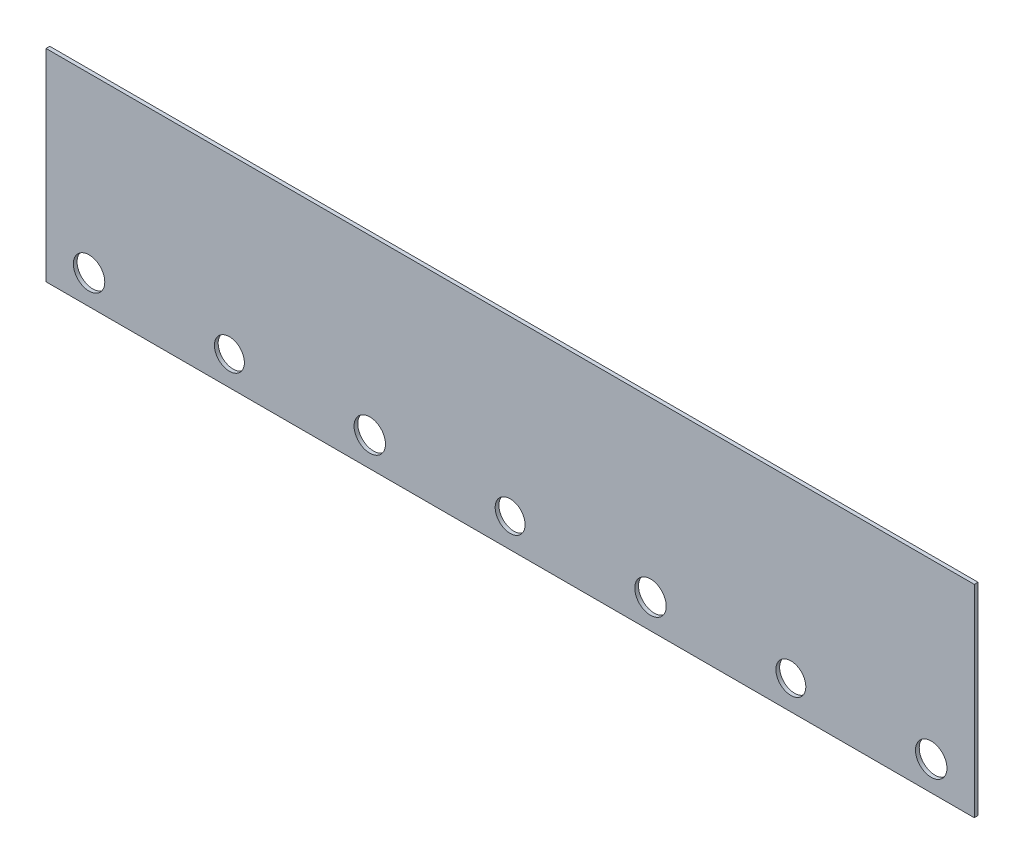
ISO-10303-21;
HEADER;
FILE_DESCRIPTION(('STEP AP214'),'2;1');
FILE_NAME('part.step','',(''),(''),'','','');
FILE_SCHEMA(('AUTOMOTIVE_DESIGN { 1 0 10303 214 1 1 1 1 }'));
ENDSEC;
DATA;
#1=APPLICATION_CONTEXT('core data for automotive mechanical design processes');
#2=APPLICATION_PROTOCOL_DEFINITION('international standard','automotive_design',2000,#1);
#3=PRODUCT_CONTEXT('',#1,'mechanical');
#4=PRODUCT('Part','Part','',(#3));
#5=PRODUCT_RELATED_PRODUCT_CATEGORY('part','',(#4));
#6=PRODUCT_DEFINITION_FORMATION('','',#4);
#7=PRODUCT_DEFINITION_CONTEXT('part definition',#1,'design');
#8=PRODUCT_DEFINITION('design','',#6,#7);
#9=PRODUCT_DEFINITION_SHAPE('','',#8);
#10=(LENGTH_UNIT() NAMED_UNIT(*) SI_UNIT(.MILLI.,.METRE.));
#11=(NAMED_UNIT(*) PLANE_ANGLE_UNIT() SI_UNIT($,.RADIAN.));
#12=(NAMED_UNIT(*) SI_UNIT($,.STERADIAN.) SOLID_ANGLE_UNIT());
#13=UNCERTAINTY_MEASURE_WITH_UNIT(LENGTH_MEASURE(1.E-05),#10,'distance_accuracy_value','');
#14=(GEOMETRIC_REPRESENTATION_CONTEXT(3) GLOBAL_UNCERTAINTY_ASSIGNED_CONTEXT((#13)) GLOBAL_UNIT_ASSIGNED_CONTEXT((#10,
#11,#12)) REPRESENTATION_CONTEXT('',''));
#15=CARTESIAN_POINT('',(0.,0.,0.));
#16=DIRECTION('',(0.,0.,1.));
#17=DIRECTION('',(1.,0.,0.));
#18=AXIS2_PLACEMENT_3D('',#15,#16,#17);
#19=CARTESIAN_POINT('',(0.,0.,40.5));
#20=DIRECTION('',(0.,0.,1.));
#21=DIRECTION('',(1.,0.,0.));
#22=AXIS2_PLACEMENT_3D('',#19,#20,#21);
#23=PLANE('',#22);
#24=CARTESIAN_POINT('',(56.25,2.89999999999965,40.5));
#25=DIRECTION('',(0.,0.,1.));
#26=DIRECTION('',(1.,0.,0.));
#27=AXIS2_PLACEMENT_3D('',#24,#25,#26);
#28=CIRCLE('',#27,2.1);
#29=CARTESIAN_POINT('',(58.35,2.89999999999965,40.5));
#30=VERTEX_POINT('',#29);
#31=EDGE_CURVE('E152',#30,#30,#28,.T.);
#32=ORIENTED_EDGE('',*,*,#31,.F.);
#33=EDGE_LOOP('',(#32));
#34=FACE_BOUND('',#33,.T.);
#35=CARTESIAN_POINT('',(-56.25,2.89999999999965,40.5));
#36=DIRECTION('',(0.,0.,1.));
#37=DIRECTION('',(1.,0.,0.));
#38=AXIS2_PLACEMENT_3D('',#35,#36,#37);
#39=CIRCLE('',#38,2.1);
#40=CARTESIAN_POINT('',(-54.15,2.89999999999965,40.5));
#41=VERTEX_POINT('',#40);
#42=EDGE_CURVE('E158',#41,#41,#39,.T.);
#43=ORIENTED_EDGE('',*,*,#42,.F.);
#44=EDGE_LOOP('',(#43));
#45=FACE_BOUND('',#44,.T.);
#46=CARTESIAN_POINT('',(-18.75,2.89999999999965,40.5));
#47=DIRECTION('',(0.,0.,1.));
#48=DIRECTION('',(1.,0.,0.));
#49=AXIS2_PLACEMENT_3D('',#46,#47,#48);
#50=CIRCLE('',#49,2.1);
#51=CARTESIAN_POINT('',(-16.65,2.89999999999965,40.5));
#52=VERTEX_POINT('',#51);
#53=EDGE_CURVE('E161',#52,#52,#50,.T.);
#54=ORIENTED_EDGE('',*,*,#53,.F.);
#55=EDGE_LOOP('',(#54));
#56=FACE_BOUND('',#55,.T.);
#57=CARTESIAN_POINT('',(18.75,2.89999999999965,40.5));
#58=DIRECTION('',(0.,0.,1.));
#59=DIRECTION('',(1.,0.,0.));
#60=AXIS2_PLACEMENT_3D('',#57,#58,#59);
#61=CIRCLE('',#60,2.1);
#62=CARTESIAN_POINT('',(20.85,2.89999999999965,40.5));
#63=VERTEX_POINT('',#62);
#64=EDGE_CURVE('E164',#63,#63,#61,.T.);
#65=ORIENTED_EDGE('',*,*,#64,.F.);
#66=EDGE_LOOP('',(#65));
#67=FACE_BOUND('',#66,.T.);
#68=CARTESIAN_POINT('',(0.,2.9,40.5));
#69=DIRECTION('',(0.,0.,1.));
#70=DIRECTION('',(1.,0.,0.));
#71=AXIS2_PLACEMENT_3D('',#68,#69,#70);
#72=CIRCLE('',#71,2.);
#73=CARTESIAN_POINT('',(2.00000000000001,2.9,40.5));
#74=VERTEX_POINT('',#73);
#75=EDGE_CURVE('E136',#74,#74,#72,.T.);
#76=ORIENTED_EDGE('',*,*,#75,.F.);
#77=EDGE_LOOP('',(#76));
#78=FACE_BOUND('',#77,.T.);
#79=DIRECTION('',(0.,1.,0.));
#80=VECTOR('',#79,1.);
#81=CARTESIAN_POINT('',(62.,26.,40.5));
#82=LINE('',#81,#80);
#83=CARTESIAN_POINT('',(62.,-1.,40.5));
#84=VERTEX_POINT('',#83);
#85=CARTESIAN_POINT('',(62.,26.,40.5));
#86=VERTEX_POINT('',#85);
#87=EDGE_CURVE('E91',#84,#86,#82,.T.);
#88=ORIENTED_EDGE('',*,*,#87,.T.);
#89=DIRECTION('',(-1.,0.,0.));
#90=VECTOR('',#89,1.);
#91=CARTESIAN_POINT('',(-62.,26.,40.5));
#92=LINE('',#91,#90);
#93=CARTESIAN_POINT('',(-62.,26.,40.5));
#94=VERTEX_POINT('',#93);
#95=EDGE_CURVE('E86',#86,#94,#92,.T.);
#96=ORIENTED_EDGE('',*,*,#95,.T.);
#97=DIRECTION('',(0.,-1.,0.));
#98=VECTOR('',#97,1.);
#99=CARTESIAN_POINT('',(-62.,26.,40.5));
#100=LINE('',#99,#98);
#101=CARTESIAN_POINT('',(-62.,-1.,40.5));
#102=VERTEX_POINT('',#101);
#103=EDGE_CURVE('E89',#94,#102,#100,.T.);
#104=ORIENTED_EDGE('',*,*,#103,.T.);
#105=DIRECTION('',(1.,0.,0.));
#106=VECTOR('',#105,1.);
#107=CARTESIAN_POINT('',(-62.,-1.,40.5));
#108=LINE('',#107,#106);
#109=EDGE_CURVE('E56',#102,#84,#108,.T.);
#110=ORIENTED_EDGE('',*,*,#109,.T.);
#111=EDGE_LOOP('',(#88,#96,#104,#110));
#112=FACE_BOUND('',#111,.T.);
#113=CARTESIAN_POINT('',(-37.5,2.9,40.5));
#114=DIRECTION('',(0.,0.,1.));
#115=DIRECTION('',(1.,0.,0.));
#116=AXIS2_PLACEMENT_3D('',#113,#114,#115);
#117=CIRCLE('',#116,2.);
#118=CARTESIAN_POINT('',(-35.5,2.9,40.5));
#119=VERTEX_POINT('',#118);
#120=EDGE_CURVE('E112',#119,#119,#117,.T.);
#121=ORIENTED_EDGE('',*,*,#120,.F.);
#122=EDGE_LOOP('',(#121));
#123=FACE_BOUND('',#122,.T.);
#124=CARTESIAN_POINT('',(37.5,2.89999999999965,40.5));
#125=DIRECTION('',(0.,0.,1.));
#126=DIRECTION('',(1.,0.,0.));
#127=AXIS2_PLACEMENT_3D('',#124,#125,#126);
#128=CIRCLE('',#127,2.00000000000001);
#129=CARTESIAN_POINT('',(39.5,2.89999999999965,40.5));
#130=VERTEX_POINT('',#129);
#131=EDGE_CURVE('E144',#130,#130,#128,.T.);
#132=ORIENTED_EDGE('',*,*,#131,.F.);
#133=EDGE_LOOP('',(#132));
#134=FACE_BOUND('',#133,.T.);
#135=ADVANCED_FACE('F38',(#34,#45,#56,#67,#78,#112,#123,#134),#23,.T.);
#136=CARTESIAN_POINT('',(0.,0.,40.));
#137=DIRECTION('',(0.,0.,1.));
#138=DIRECTION('',(1.,0.,0.));
#139=AXIS2_PLACEMENT_3D('',#136,#137,#138);
#140=PLANE('',#139);
#141=CARTESIAN_POINT('',(56.25,2.89999999999965,40.));
#142=DIRECTION('',(0.,0.,1.));
#143=DIRECTION('',(-1.,0.,0.));
#144=AXIS2_PLACEMENT_3D('',#141,#142,#143);
#145=CIRCLE('',#144,2.1);
#146=CARTESIAN_POINT('',(54.15,2.89999999999965,40.));
#147=VERTEX_POINT('',#146);
#148=EDGE_CURVE('E170',#147,#147,#145,.T.);
#149=ORIENTED_EDGE('',*,*,#148,.T.);
#150=EDGE_LOOP('',(#149));
#151=FACE_BOUND('',#150,.T.);
#152=CARTESIAN_POINT('',(-56.25,2.89999999999965,40.));
#153=DIRECTION('',(0.,0.,1.));
#154=DIRECTION('',(1.,0.,0.));
#155=AXIS2_PLACEMENT_3D('',#152,#153,#154);
#156=CIRCLE('',#155,2.1);
#157=CARTESIAN_POINT('',(-54.15,2.89999999999965,40.));
#158=VERTEX_POINT('',#157);
#159=EDGE_CURVE('E171',#158,#158,#156,.T.);
#160=ORIENTED_EDGE('',*,*,#159,.T.);
#161=EDGE_LOOP('',(#160));
#162=FACE_BOUND('',#161,.T.);
#163=CARTESIAN_POINT('',(-18.75,2.89999999999965,40.));
#164=DIRECTION('',(0.,0.,1.));
#165=DIRECTION('',(-1.,0.,0.));
#166=AXIS2_PLACEMENT_3D('',#163,#164,#165);
#167=CIRCLE('',#166,2.1);
#168=CARTESIAN_POINT('',(-20.85,2.89999999999965,40.));
#169=VERTEX_POINT('',#168);
#170=EDGE_CURVE('E174',#169,#169,#167,.T.);
#171=ORIENTED_EDGE('',*,*,#170,.T.);
#172=EDGE_LOOP('',(#171));
#173=FACE_BOUND('',#172,.T.);
#174=CARTESIAN_POINT('',(18.75,2.89999999999965,40.));
#175=DIRECTION('',(0.,0.,1.));
#176=DIRECTION('',(1.,0.,0.));
#177=AXIS2_PLACEMENT_3D('',#174,#175,#176);
#178=CIRCLE('',#177,2.1);
#179=CARTESIAN_POINT('',(20.85,2.89999999999965,40.));
#180=VERTEX_POINT('',#179);
#181=EDGE_CURVE('E167',#180,#180,#178,.T.);
#182=ORIENTED_EDGE('',*,*,#181,.T.);
#183=EDGE_LOOP('',(#182));
#184=FACE_BOUND('',#183,.T.);
#185=DIRECTION('',(0.,1.,0.));
#186=VECTOR('',#185,1.);
#187=CARTESIAN_POINT('',(62.,26.,40.));
#188=LINE('',#187,#186);
#189=CARTESIAN_POINT('',(62.,-1.,40.));
#190=VERTEX_POINT('',#189);
#191=CARTESIAN_POINT('',(62.,26.,40.));
#192=VERTEX_POINT('',#191);
#193=EDGE_CURVE('E108',#190,#192,#188,.T.);
#194=ORIENTED_EDGE('',*,*,#193,.F.);
#195=DIRECTION('',(1.,0.,0.));
#196=VECTOR('',#195,1.);
#197=CARTESIAN_POINT('',(-62.,-1.,40.));
#198=LINE('',#197,#196);
#199=CARTESIAN_POINT('',(-62.,-1.,40.));
#200=VERTEX_POINT('',#199);
#201=EDGE_CURVE('E79',#200,#190,#198,.T.);
#202=ORIENTED_EDGE('',*,*,#201,.F.);
#203=DIRECTION('',(0.,-1.,0.));
#204=VECTOR('',#203,1.);
#205=CARTESIAN_POINT('',(-62.,26.,40.));
#206=LINE('',#205,#204);
#207=CARTESIAN_POINT('',(-62.,26.,40.));
#208=VERTEX_POINT('',#207);
#209=EDGE_CURVE('E73',#208,#200,#206,.T.);
#210=ORIENTED_EDGE('',*,*,#209,.F.);
#211=DIRECTION('',(-1.,0.,0.));
#212=VECTOR('',#211,1.);
#213=CARTESIAN_POINT('',(-62.,26.,40.));
#214=LINE('',#213,#212);
#215=EDGE_CURVE('E96',#192,#208,#214,.T.);
#216=ORIENTED_EDGE('',*,*,#215,.F.);
#217=EDGE_LOOP('',(#194,#202,#210,#216));
#218=FACE_BOUND('',#217,.T.);
#219=CARTESIAN_POINT('',(-37.5,2.9,40.));
#220=DIRECTION('',(0.,0.,1.));
#221=DIRECTION('',(1.,0.,0.));
#222=AXIS2_PLACEMENT_3D('',#219,#220,#221);
#223=CIRCLE('',#222,2.);
#224=CARTESIAN_POINT('',(-35.5,2.9,40.));
#225=VERTEX_POINT('',#224);
#226=EDGE_CURVE('E133',#225,#225,#223,.T.);
#227=ORIENTED_EDGE('',*,*,#226,.T.);
#228=EDGE_LOOP('',(#227));
#229=FACE_BOUND('',#228,.T.);
#230=CARTESIAN_POINT('',(0.,2.9,40.));
#231=DIRECTION('',(0.,0.,1.));
#232=DIRECTION('',(1.,0.,0.));
#233=AXIS2_PLACEMENT_3D('',#230,#231,#232);
#234=CIRCLE('',#233,2.);
#235=CARTESIAN_POINT('',(2.00000000000001,2.9,40.));
#236=VERTEX_POINT('',#235);
#237=EDGE_CURVE('E140',#236,#236,#234,.T.);
#238=ORIENTED_EDGE('',*,*,#237,.T.);
#239=EDGE_LOOP('',(#238));
#240=FACE_BOUND('',#239,.T.);
#241=CARTESIAN_POINT('',(37.5,2.89999999999965,40.));
#242=DIRECTION('',(0.,0.,1.));
#243=DIRECTION('',(1.,0.,0.));
#244=AXIS2_PLACEMENT_3D('',#241,#242,#243);
#245=CIRCLE('',#244,2.00000000000001);
#246=CARTESIAN_POINT('',(39.5,2.89999999999965,40.));
#247=VERTEX_POINT('',#246);
#248=EDGE_CURVE('E148',#247,#247,#245,.T.);
#249=ORIENTED_EDGE('',*,*,#248,.T.);
#250=EDGE_LOOP('',(#249));
#251=FACE_BOUND('',#250,.T.);
#252=ADVANCED_FACE('F127',(#151,#162,#173,#184,#218,#229,#240,#251),#140,.F.);
#253=CARTESIAN_POINT('',(62.,26.,40.5));
#254=DIRECTION('',(-1.,0.,0.));
#255=DIRECTION('',(0.,0.,1.));
#256=AXIS2_PLACEMENT_3D('',#253,#254,#255);
#257=PLANE('',#256);
#258=ORIENTED_EDGE('',*,*,#193,.T.);
#259=DIRECTION('',(0.,0.,-1.));
#260=VECTOR('',#259,1.);
#261=CARTESIAN_POINT('',(62.,26.,40.5));
#262=LINE('',#261,#260);
#263=EDGE_CURVE('E11',#86,#192,#262,.T.);
#264=ORIENTED_EDGE('',*,*,#263,.F.);
#265=ORIENTED_EDGE('',*,*,#87,.F.);
#266=DIRECTION('',(0.,0.,-1.));
#267=VECTOR('',#266,1.);
#268=CARTESIAN_POINT('',(62.,-1.,40.5));
#269=LINE('',#268,#267);
#270=EDGE_CURVE('E104',#84,#190,#269,.T.);
#271=ORIENTED_EDGE('',*,*,#270,.T.);
#272=EDGE_LOOP('',(#258,#264,#265,#271));
#273=FACE_BOUND('',#272,.T.);
#274=ADVANCED_FACE('F40',(#273),#257,.F.);
#275=CARTESIAN_POINT('',(-62.,26.,40.5));
#276=DIRECTION('',(0.,-1.,0.));
#277=DIRECTION('',(0.,0.,-1.));
#278=AXIS2_PLACEMENT_3D('',#275,#276,#277);
#279=PLANE('',#278);
#280=ORIENTED_EDGE('',*,*,#215,.T.);
#281=DIRECTION('',(0.,0.,-1.));
#282=VECTOR('',#281,1.);
#283=CARTESIAN_POINT('',(-62.,26.,40.5));
#284=LINE('',#283,#282);
#285=EDGE_CURVE('E48',#94,#208,#284,.T.);
#286=ORIENTED_EDGE('',*,*,#285,.F.);
#287=ORIENTED_EDGE('',*,*,#95,.F.);
#288=ORIENTED_EDGE('',*,*,#263,.T.);
#289=EDGE_LOOP('',(#280,#286,#287,#288));
#290=FACE_BOUND('',#289,.T.);
#291=ADVANCED_FACE('F95',(#290),#279,.F.);
#292=CARTESIAN_POINT('',(-62.,26.,40.5));
#293=DIRECTION('',(1.,0.,0.));
#294=DIRECTION('',(0.,1.,0.));
#295=AXIS2_PLACEMENT_3D('',#292,#293,#294);
#296=PLANE('',#295);
#297=ORIENTED_EDGE('',*,*,#209,.T.);
#298=DIRECTION('',(0.,0.,-1.));
#299=VECTOR('',#298,1.);
#300=CARTESIAN_POINT('',(-62.,-1.,40.5));
#301=LINE('',#300,#299);
#302=EDGE_CURVE('E98',#102,#200,#301,.T.);
#303=ORIENTED_EDGE('',*,*,#302,.F.);
#304=ORIENTED_EDGE('',*,*,#103,.F.);
#305=ORIENTED_EDGE('',*,*,#285,.T.);
#306=EDGE_LOOP('',(#297,#303,#304,#305));
#307=FACE_BOUND('',#306,.T.);
#308=ADVANCED_FACE('F99',(#307),#296,.F.);
#309=CARTESIAN_POINT('',(-62.,-1.,40.5));
#310=DIRECTION('',(0.,1.,0.));
#311=DIRECTION('',(0.,0.,1.));
#312=AXIS2_PLACEMENT_3D('',#309,#310,#311);
#313=PLANE('',#312);
#314=ORIENTED_EDGE('',*,*,#201,.T.);
#315=ORIENTED_EDGE('',*,*,#270,.F.);
#316=ORIENTED_EDGE('',*,*,#109,.F.);
#317=ORIENTED_EDGE('',*,*,#302,.T.);
#318=EDGE_LOOP('',(#314,#315,#316,#317));
#319=FACE_BOUND('',#318,.T.);
#320=ADVANCED_FACE('F124',(#319),#313,.F.);
#321=CARTESIAN_POINT('',(-37.5,2.9,40.5));
#322=DIRECTION('',(0.,0.,-1.));
#323=DIRECTION('',(-1.,0.,0.));
#324=AXIS2_PLACEMENT_3D('',#321,#322,#323);
#325=CYLINDRICAL_SURFACE('',#324,2.);
#326=ORIENTED_EDGE('',*,*,#120,.T.);
#327=EDGE_LOOP('',(#326));
#328=FACE_BOUND('',#327,.T.);
#329=ORIENTED_EDGE('',*,*,#226,.F.);
#330=EDGE_LOOP('',(#329));
#331=FACE_BOUND('',#330,.T.);
#332=ADVANCED_FACE('F210',(#328,#331),#325,.F.);
#333=CARTESIAN_POINT('',(0.,2.9,40.5));
#334=DIRECTION('',(0.,0.,-1.));
#335=DIRECTION('',(-1.,0.,0.));
#336=AXIS2_PLACEMENT_3D('',#333,#334,#335);
#337=CYLINDRICAL_SURFACE('',#336,2.);
#338=ORIENTED_EDGE('',*,*,#75,.T.);
#339=EDGE_LOOP('',(#338));
#340=FACE_BOUND('',#339,.T.);
#341=ORIENTED_EDGE('',*,*,#237,.F.);
#342=EDGE_LOOP('',(#341));
#343=FACE_BOUND('',#342,.T.);
#344=ADVANCED_FACE('F272',(#340,#343),#337,.F.);
#345=CARTESIAN_POINT('',(37.5,2.89999999999965,40.5));
#346=DIRECTION('',(0.,0.,-1.));
#347=DIRECTION('',(-1.,0.,0.));
#348=AXIS2_PLACEMENT_3D('',#345,#346,#347);
#349=CYLINDRICAL_SURFACE('',#348,2.00000000000001);
#350=ORIENTED_EDGE('',*,*,#131,.T.);
#351=EDGE_LOOP('',(#350));
#352=FACE_BOUND('',#351,.T.);
#353=ORIENTED_EDGE('',*,*,#248,.F.);
#354=EDGE_LOOP('',(#353));
#355=FACE_BOUND('',#354,.T.);
#356=ADVANCED_FACE('F195',(#352,#355),#349,.F.);
#357=CARTESIAN_POINT('',(18.75,2.89999999999965,40.));
#358=DIRECTION('',(0.,0.,1.));
#359=DIRECTION('',(1.,0.,0.));
#360=AXIS2_PLACEMENT_3D('',#357,#358,#359);
#361=CYLINDRICAL_SURFACE('',#360,2.1);
#362=ORIENTED_EDGE('',*,*,#64,.T.);
#363=EDGE_LOOP('',(#362));
#364=FACE_BOUND('',#363,.T.);
#365=ORIENTED_EDGE('',*,*,#181,.F.);
#366=EDGE_LOOP('',(#365));
#367=FACE_BOUND('',#366,.T.);
#368=ADVANCED_FACE('F185',(#364,#367),#361,.F.);
#369=CARTESIAN_POINT('',(-18.75,2.89999999999965,40.));
#370=DIRECTION('',(0.,0.,1.));
#371=DIRECTION('',(1.,0.,0.));
#372=AXIS2_PLACEMENT_3D('',#369,#370,#371);
#373=CYLINDRICAL_SURFACE('',#372,2.1);
#374=ORIENTED_EDGE('',*,*,#53,.T.);
#375=EDGE_LOOP('',(#374));
#376=FACE_BOUND('',#375,.T.);
#377=ORIENTED_EDGE('',*,*,#170,.F.);
#378=EDGE_LOOP('',(#377));
#379=FACE_BOUND('',#378,.T.);
#380=ADVANCED_FACE('F182',(#376,#379),#373,.F.);
#381=CARTESIAN_POINT('',(-56.25,2.89999999999965,40.));
#382=DIRECTION('',(0.,0.,1.));
#383=DIRECTION('',(1.,0.,0.));
#384=AXIS2_PLACEMENT_3D('',#381,#382,#383);
#385=CYLINDRICAL_SURFACE('',#384,2.1);
#386=ORIENTED_EDGE('',*,*,#42,.T.);
#387=EDGE_LOOP('',(#386));
#388=FACE_BOUND('',#387,.T.);
#389=ORIENTED_EDGE('',*,*,#159,.F.);
#390=EDGE_LOOP('',(#389));
#391=FACE_BOUND('',#390,.T.);
#392=ADVANCED_FACE('F184',(#388,#391),#385,.F.);
#393=CARTESIAN_POINT('',(56.25,2.89999999999965,40.));
#394=DIRECTION('',(0.,0.,1.));
#395=DIRECTION('',(1.,0.,0.));
#396=AXIS2_PLACEMENT_3D('',#393,#394,#395);
#397=CYLINDRICAL_SURFACE('',#396,2.1);
#398=ORIENTED_EDGE('',*,*,#31,.T.);
#399=EDGE_LOOP('',(#398));
#400=FACE_BOUND('',#399,.T.);
#401=ORIENTED_EDGE('',*,*,#148,.F.);
#402=EDGE_LOOP('',(#401));
#403=FACE_BOUND('',#402,.T.);
#404=ADVANCED_FACE('F192',(#400,#403),#397,.F.);
#405=CLOSED_SHELL('',(#135,#252,#274,#291,#308,#320,#332,#344,#356,#368,#380,#392,#404));
#406=MANIFOLD_SOLID_BREP('B2',#405);
#407=ADVANCED_BREP_SHAPE_REPRESENTATION('',(#18,#406),#14);
#408=SHAPE_DEFINITION_REPRESENTATION(#9,#407);
ENDSEC;
END-ISO-10303-21;
